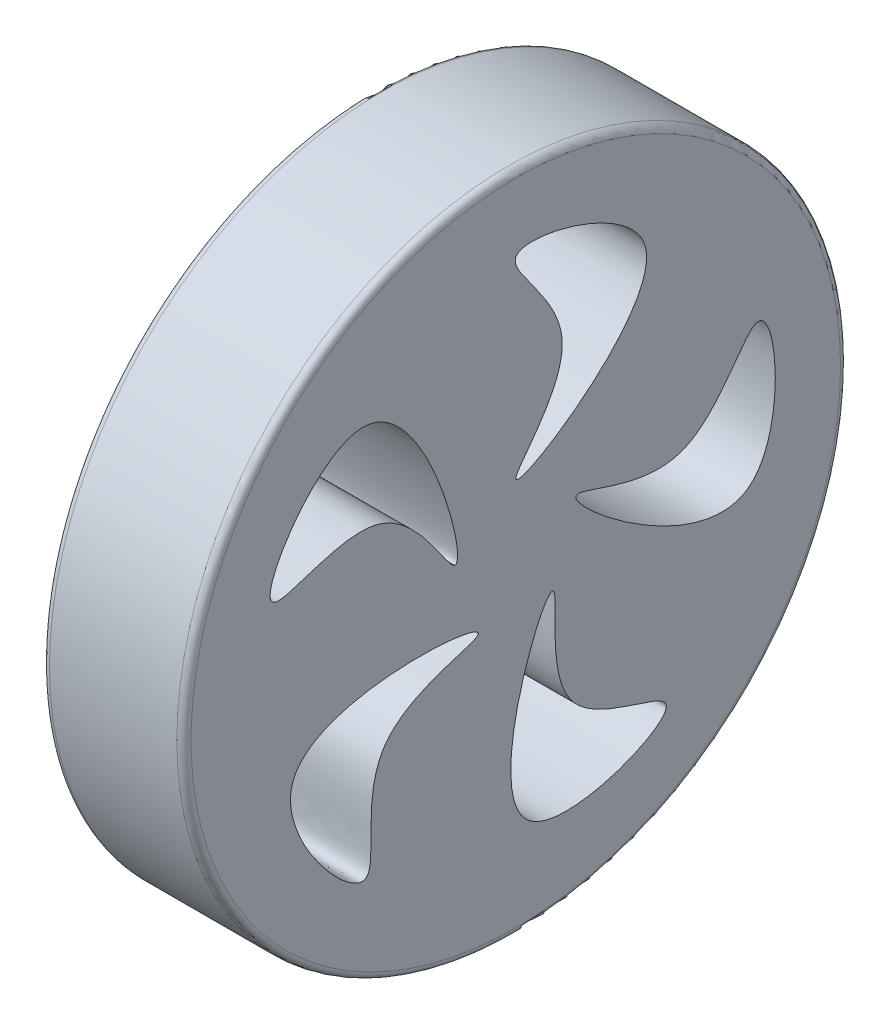
ISO-10303-21;
HEADER;
FILE_DESCRIPTION(('STEP AP214'),'2;1');
FILE_NAME('part.step','',(''),(''),'','','');
FILE_SCHEMA(('AUTOMOTIVE_DESIGN { 1 0 10303 214 1 1 1 1 }'));
ENDSEC;
DATA;
#1=APPLICATION_CONTEXT('core data for automotive mechanical design processes');
#2=APPLICATION_PROTOCOL_DEFINITION('international standard','automotive_design',2000,#1);
#3=PRODUCT_CONTEXT('',#1,'mechanical');
#4=PRODUCT('Part','Part','',(#3));
#5=PRODUCT_RELATED_PRODUCT_CATEGORY('part','',(#4));
#6=PRODUCT_DEFINITION_FORMATION('','',#4);
#7=PRODUCT_DEFINITION_CONTEXT('part definition',#1,'design');
#8=PRODUCT_DEFINITION('design','',#6,#7);
#9=PRODUCT_DEFINITION_SHAPE('','',#8);
#10=(LENGTH_UNIT() NAMED_UNIT(*) SI_UNIT(.MILLI.,.METRE.));
#11=(NAMED_UNIT(*) PLANE_ANGLE_UNIT() SI_UNIT($,.RADIAN.));
#12=(NAMED_UNIT(*) SI_UNIT($,.STERADIAN.) SOLID_ANGLE_UNIT());
#13=UNCERTAINTY_MEASURE_WITH_UNIT(LENGTH_MEASURE(1.E-05),#10,'distance_accuracy_value','');
#14=(GEOMETRIC_REPRESENTATION_CONTEXT(3) GLOBAL_UNCERTAINTY_ASSIGNED_CONTEXT((#13)) GLOBAL_UNIT_ASSIGNED_CONTEXT((#10,
#11,#12)) REPRESENTATION_CONTEXT('',''));
#15=CARTESIAN_POINT('',(0.,0.,0.));
#16=DIRECTION('',(0.,0.,1.));
#17=DIRECTION('',(1.,0.,0.));
#18=AXIS2_PLACEMENT_3D('',#15,#16,#17);
#19=CARTESIAN_POINT('',(20.,0.,0.));
#20=DIRECTION('',(-1.,0.,0.));
#21=DIRECTION('',(0.,0.,1.));
#22=AXIS2_PLACEMENT_3D('',#19,#20,#21);
#23=CYLINDRICAL_SURFACE('',#22,46.88);
#24=CARTESIAN_POINT('',(1.,0.,0.));
#25=DIRECTION('',(1.,0.,0.));
#26=DIRECTION('',(0.,0.,-1.));
#27=AXIS2_PLACEMENT_3D('',#24,#25,#26);
#28=CIRCLE('',#27,46.88);
#29=CARTESIAN_POINT('',(1.,0.,-46.88));
#30=VERTEX_POINT('',#29);
#31=EDGE_CURVE('E45',#30,#30,#28,.T.);
#32=ORIENTED_EDGE('',*,*,#31,.T.);
#33=EDGE_LOOP('',(#32));
#34=FACE_BOUND('',#33,.T.);
#35=CARTESIAN_POINT('',(19.,0.,0.));
#36=DIRECTION('',(1.,0.,0.));
#37=DIRECTION('',(0.,0.,-1.));
#38=AXIS2_PLACEMENT_3D('',#35,#36,#37);
#39=CIRCLE('',#38,46.88);
#40=CARTESIAN_POINT('',(19.,0.,-46.88));
#41=VERTEX_POINT('',#40);
#42=EDGE_CURVE('E49',#41,#41,#39,.F.);
#43=ORIENTED_EDGE('',*,*,#42,.T.);
#44=EDGE_LOOP('',(#43));
#45=FACE_BOUND('',#44,.T.);
#46=ADVANCED_FACE('F34',(#34,#45),#23,.T.);
#47=CARTESIAN_POINT('',(20.,0.,0.));
#48=DIRECTION('',(1.,0.,0.));
#49=DIRECTION('',(0.,0.,-1.));
#50=AXIS2_PLACEMENT_3D('',#47,#48,#49);
#51=PLANE('',#50);
#52=CARTESIAN_POINT('',(20.,0.,0.));
#53=DIRECTION('',(1.,0.,0.));
#54=DIRECTION('',(0.,0.,-1.));
#55=AXIS2_PLACEMENT_3D('',#52,#53,#54);
#56=CIRCLE('',#55,45.88);
#57=CARTESIAN_POINT('',(20.,0.,-45.88));
#58=VERTEX_POINT('',#57);
#59=EDGE_CURVE('E10',#58,#58,#56,.T.);
#60=ORIENTED_EDGE('',*,*,#59,.T.);
#61=EDGE_LOOP('',(#60));
#62=FACE_BOUND('',#61,.T.);
#63=CARTESIAN_POINT('',(20.,2.81803090171412,8.67300731345636));
#64=CARTESIAN_POINT('',(20.,1.9904427025529,6.4759868003006));
#65=CARTESIAN_POINT('',(20.,43.958070461011,17.0065174393699));
#66=CARTESIAN_POINT('',(20.,2.99113893993357,42.797354133509));
#67=CARTESIAN_POINT('',(20.,19.9397960038693,17.5810966951113));
#68=CARTESIAN_POINT('',(20.,3.28104704623283,9.90218864840154));
#69=CARTESIAN_POINT('',(20.,2.81803090171412,8.67300731345636));
#70=B_SPLINE_CURVE_WITH_KNOTS('',3,(#63,#64,#65,#66,#67,#68,#69),.UNSPECIFIED.,.T.,.F.,(4,1,1,1,
4),(0.,0.348478422836538,0.606981044630408,0.805034513598355,1.),.UNSPECIFIED.);
#71=CARTESIAN_POINT('',(20.,2.81803090171412,8.67300731345636));
#72=VERTEX_POINT('',#71);
#73=EDGE_CURVE('E129',#72,#72,#70,.T.);
#74=ORIENTED_EDGE('',*,*,#73,.F.);
#75=EDGE_LOOP('',(#74));
#76=FACE_BOUND('',#75,.T.);
#77=CARTESIAN_POINT('',(20.,-7.37770068203479,5.36021330439252));
#78=CARTESIAN_POINT('',(20.,-5.54394882444884,3.89421347921577));
#79=CARTESIAN_POINT('',(20.,-2.5903684178162,47.0619122596052));
#80=CARTESIAN_POINT('',(20.,-39.7783897638889,16.0698519215051));
#81=CARTESIAN_POINT('',(20.,-10.5588807459356,24.3967305816145));
#82=CARTESIAN_POINT('',(20.,-8.40364174301653,6.18040574745343));
#83=CARTESIAN_POINT('',(20.,-7.37770068203479,5.36021330439252));
#84=B_SPLINE_CURVE_WITH_KNOTS('',3,(#77,#78,#79,#80,#81,#82,#83),.UNSPECIFIED.,.T.,.F.,(4,1,1,1,
4),(0.,0.348478422836538,0.606981044630408,0.805034513598355,1.),.UNSPECIFIED.);
#85=CARTESIAN_POINT('',(20.,-7.37770068203479,5.36021330439252));
#86=VERTEX_POINT('',#85);
#87=EDGE_CURVE('E143',#86,#86,#84,.T.);
#88=ORIENTED_EDGE('',*,*,#87,.F.);
#89=EDGE_LOOP('',(#88));
#90=FACE_BOUND('',#89,.T.);
#91=CARTESIAN_POINT('',(20.,-7.37770068203486,-5.36021330439242));
#92=CARTESIAN_POINT('',(20.,-5.41679150795228,-4.06923051069728));
#93=CARTESIAN_POINT('',(20.,-45.5590061866057,12.0793439126313));
#94=CARTESIAN_POINT('',(20.,-27.5755358317576,-32.8656394518411));
#95=CARTESIAN_POINT('',(20.,-26.4655431880142,-2.50308798129966));
#96=CARTESIAN_POINT('',(20.,-8.4747832726944,-6.08248783221015));
#97=CARTESIAN_POINT('',(20.,-7.37770068203486,-5.36021330439242));
#98=B_SPLINE_CURVE_WITH_KNOTS('',3,(#91,#92,#93,#94,#95,#96,#97),.UNSPECIFIED.,.T.,.F.,(4,1,1,1,
4),(0.,0.348478422836538,0.606981044630408,0.805034513598355,1.),.UNSPECIFIED.);
#99=CARTESIAN_POINT('',(20.,-7.37770068203486,-5.36021330439242));
#100=VERTEX_POINT('',#99);
#101=EDGE_CURVE('E166',#100,#100,#98,.T.);
#102=ORIENTED_EDGE('',*,*,#101,.F.);
#103=EDGE_LOOP('',(#102));
#104=FACE_BOUND('',#103,.T.);
#105=CARTESIAN_POINT('',(20.,2.818030901714,-8.6730073134564));
#106=CARTESIAN_POINT('',(20.,2.19618756256258,-6.40913624288477));
#107=CARTESIAN_POINT('',(20.,-25.5666458991726,-39.5964671598));
#108=CARTESIAN_POINT('',(20.,22.7357713618723,-36.3819341647422));
#109=CARTESIAN_POINT('',(20.,-5.79772447498533,-25.9437240308891));
#110=CARTESIAN_POINT('',(20.,3.16593763320237,-9.93958996391694));
#111=CARTESIAN_POINT('',(20.,2.818030901714,-8.6730073134564));
#112=B_SPLINE_CURVE_WITH_KNOTS('',3,(#105,#106,#107,#108,#109,#110,#111),.UNSPECIFIED.,.T.,.F.,
(4,1,1,1,4),(0.,0.348478422836538,0.606981044630408,0.805034513598355,1.),.UNSPECIFIED.);
#113=CARTESIAN_POINT('',(20.,2.818030901714,-8.6730073134564));
#114=VERTEX_POINT('',#113);
#115=EDGE_CURVE('E193',#114,#114,#112,.T.);
#116=ORIENTED_EDGE('',*,*,#115,.F.);
#117=EDGE_LOOP('',(#116));
#118=FACE_BOUND('',#117,.T.);
#119=CARTESIAN_POINT('',(20.,9.11933934697701,1.45791625618525E-07));
#120=CARTESIAN_POINT('',(20.,6.77410984689813,0.108166639441142));
#121=CARTESIAN_POINT('',(20.,29.7579501299263,-36.55130688248));
#122=CARTESIAN_POINT('',(20.,41.6270153453987,10.3803678262817));
#123=CARTESIAN_POINT('',(20.,22.8823523792061,-13.5310154591588));
#124=CARTESIAN_POINT('',(20.,10.4314401344158,-0.0605164652638171));
#125=CARTESIAN_POINT('',(20.,9.11933934697701,1.45791625618525E-07));
#126=B_SPLINE_CURVE_WITH_KNOTS('',3,(#119,#120,#121,#122,#123,#124,#125),.UNSPECIFIED.,.T.,.F.,
(4,1,1,1,4),(0.,0.348478423266489,0.606981044681602,0.805034512162665,1.),.UNSPECIFIED.);
#127=CARTESIAN_POINT('',(20.,9.11933934697701,1.45791625618525E-07));
#128=VERTEX_POINT('',#127);
#129=EDGE_CURVE('E59',#128,#128,#126,.T.);
#130=ORIENTED_EDGE('',*,*,#129,.F.);
#131=EDGE_LOOP('',(#130));
#132=FACE_BOUND('',#131,.T.);
#133=ADVANCED_FACE('F91',(#62,#76,#90,#104,#118,#132),#51,.T.);
#134=CARTESIAN_POINT('',(0.,0.,0.));
#135=DIRECTION('',(1.,0.,0.));
#136=DIRECTION('',(0.,0.,-1.));
#137=AXIS2_PLACEMENT_3D('',#134,#135,#136);
#138=PLANE('',#137);
#139=CARTESIAN_POINT('',(0.,0.,0.));
#140=DIRECTION('',(1.,0.,0.));
#141=DIRECTION('',(0.,0.,-1.));
#142=AXIS2_PLACEMENT_3D('',#139,#140,#141);
#143=CIRCLE('',#142,45.88);
#144=CARTESIAN_POINT('',(0.,0.,-45.88));
#145=VERTEX_POINT('',#144);
#146=EDGE_CURVE('E41',#145,#145,#143,.F.);
#147=ORIENTED_EDGE('',*,*,#146,.T.);
#148=EDGE_LOOP('',(#147));
#149=FACE_BOUND('',#148,.T.);
#150=CARTESIAN_POINT('',(0.,2.81803090171412,8.67300731345636));
#151=CARTESIAN_POINT('',(0.,1.9904427025529,6.4759868003006));
#152=CARTESIAN_POINT('',(0.,43.958070461011,17.0065174393699));
#153=CARTESIAN_POINT('',(0.,2.99113893993357,42.797354133509));
#154=CARTESIAN_POINT('',(0.,19.9397960038693,17.5810966951113));
#155=CARTESIAN_POINT('',(0.,3.28104704623283,9.90218864840154));
#156=CARTESIAN_POINT('',(0.,2.81803090171412,8.67300731345636));
#157=B_SPLINE_CURVE_WITH_KNOTS('',3,(#150,#151,#152,#153,#154,#155,#156),.UNSPECIFIED.,.T.,.F.,
(4,1,1,1,4),(0.,0.348478422836538,0.606981044630408,0.805034513598355,1.),.UNSPECIFIED.);
#158=CARTESIAN_POINT('',(0.,2.81803090171412,8.67300731345636));
#159=VERTEX_POINT('',#158);
#160=EDGE_CURVE('E136',#159,#159,#157,.F.);
#161=ORIENTED_EDGE('',*,*,#160,.F.);
#162=EDGE_LOOP('',(#161));
#163=FACE_BOUND('',#162,.T.);
#164=CARTESIAN_POINT('',(0.,-7.37770068203479,5.36021330439252));
#165=CARTESIAN_POINT('',(0.,-5.54394882444884,3.89421347921577));
#166=CARTESIAN_POINT('',(0.,-2.5903684178162,47.0619122596052));
#167=CARTESIAN_POINT('',(0.,-39.7783897638889,16.0698519215051));
#168=CARTESIAN_POINT('',(0.,-10.5588807459356,24.3967305816145));
#169=CARTESIAN_POINT('',(0.,-8.40364174301653,6.18040574745343));
#170=CARTESIAN_POINT('',(0.,-7.37770068203479,5.36021330439252));
#171=B_SPLINE_CURVE_WITH_KNOTS('',3,(#164,#165,#166,#167,#168,#169,#170),.UNSPECIFIED.,.T.,.F.,
(4,1,1,1,4),(0.,0.348478422836538,0.606981044630408,0.805034513598355,1.),.UNSPECIFIED.);
#172=CARTESIAN_POINT('',(0.,-7.37770068203479,5.36021330439252));
#173=VERTEX_POINT('',#172);
#174=EDGE_CURVE('E158',#173,#173,#171,.F.);
#175=ORIENTED_EDGE('',*,*,#174,.F.);
#176=EDGE_LOOP('',(#175));
#177=FACE_BOUND('',#176,.T.);
#178=CARTESIAN_POINT('',(0.,-7.37770068203486,-5.36021330439242));
#179=CARTESIAN_POINT('',(0.,-5.41679150795228,-4.06923051069728));
#180=CARTESIAN_POINT('',(0.,-45.5590061866057,12.0793439126313));
#181=CARTESIAN_POINT('',(0.,-27.5755358317576,-32.8656394518411));
#182=CARTESIAN_POINT('',(0.,-26.4655431880142,-2.50308798129966));
#183=CARTESIAN_POINT('',(0.,-8.4747832726944,-6.08248783221015));
#184=CARTESIAN_POINT('',(0.,-7.37770068203486,-5.36021330439242));
#185=B_SPLINE_CURVE_WITH_KNOTS('',3,(#178,#179,#180,#181,#182,#183,#184),.UNSPECIFIED.,.T.,.F.,
(4,1,1,1,4),(0.,0.348478422836538,0.606981044630408,0.805034513598355,1.),.UNSPECIFIED.);
#186=CARTESIAN_POINT('',(0.,-7.37770068203486,-5.36021330439242));
#187=VERTEX_POINT('',#186);
#188=EDGE_CURVE('E191',#187,#187,#185,.F.);
#189=ORIENTED_EDGE('',*,*,#188,.F.);
#190=EDGE_LOOP('',(#189));
#191=FACE_BOUND('',#190,.T.);
#192=CARTESIAN_POINT('',(0.,2.818030901714,-8.6730073134564));
#193=CARTESIAN_POINT('',(0.,2.19618756256258,-6.40913624288477));
#194=CARTESIAN_POINT('',(0.,-25.5666458991726,-39.5964671598));
#195=CARTESIAN_POINT('',(0.,22.7357713618723,-36.3819341647422));
#196=CARTESIAN_POINT('',(0.,-5.79772447498533,-25.9437240308891));
#197=CARTESIAN_POINT('',(0.,3.16593763320237,-9.93958996391694));
#198=CARTESIAN_POINT('',(0.,2.818030901714,-8.6730073134564));
#199=B_SPLINE_CURVE_WITH_KNOTS('',3,(#192,#193,#194,#195,#196,#197,#198),.UNSPECIFIED.,.T.,.F.,
(4,1,1,1,4),(0.,0.348478422836538,0.606981044630408,0.805034513598355,1.),.UNSPECIFIED.);
#200=CARTESIAN_POINT('',(0.,2.818030901714,-8.6730073134564));
#201=VERTEX_POINT('',#200);
#202=EDGE_CURVE('E67',#201,#201,#199,.F.);
#203=ORIENTED_EDGE('',*,*,#202,.F.);
#204=EDGE_LOOP('',(#203));
#205=FACE_BOUND('',#204,.T.);
#206=CARTESIAN_POINT('',(0.,9.11933934697701,1.45791625618525E-07));
#207=CARTESIAN_POINT('',(0.,6.77410984689813,0.108166639441142));
#208=CARTESIAN_POINT('',(0.,29.7579501299263,-36.55130688248));
#209=CARTESIAN_POINT('',(0.,41.6270153453987,10.3803678262817));
#210=CARTESIAN_POINT('',(0.,22.8823523792061,-13.5310154591588));
#211=CARTESIAN_POINT('',(0.,10.4314401344158,-0.0605164652638171));
#212=CARTESIAN_POINT('',(0.,9.11933934697701,1.45791625618525E-07));
#213=B_SPLINE_CURVE_WITH_KNOTS('',3,(#206,#207,#208,#209,#210,#211,#212),.UNSPECIFIED.,.T.,.F.,
(4,1,1,1,4),(0.,0.348478423266489,0.606981044681602,0.805034512162665,1.),.UNSPECIFIED.);
#214=CARTESIAN_POINT('',(0.,9.11933934697701,1.45791625618525E-07));
#215=VERTEX_POINT('',#214);
#216=EDGE_CURVE('E54',#215,#215,#213,.F.);
#217=ORIENTED_EDGE('',*,*,#216,.F.);
#218=EDGE_LOOP('',(#217));
#219=FACE_BOUND('',#218,.T.);
#220=ADVANCED_FACE('F87',(#149,#163,#177,#191,#205,#219),#138,.F.);
#221=CARTESIAN_POINT('',(-0.001000000000001,9.11933934697701,1.45791625618525E-07));
#222=CARTESIAN_POINT('',(-0.001000000000001,6.77410984689813,0.108166639441142));
#223=CARTESIAN_POINT('',(-0.001000000000001,29.7579501299263,-36.55130688248));
#224=CARTESIAN_POINT('',(-0.001000000000001,41.6270153453987,10.3803678262817));
#225=CARTESIAN_POINT('',(-0.001000000000001,22.8823523792061,-13.5310154591588));
#226=CARTESIAN_POINT('',(-0.001000000000001,10.4314401344158,-0.0605164652638171));
#227=CARTESIAN_POINT('',(-0.001000000000001,9.11933934697701,1.45791625618525E-07));
#228=B_SPLINE_CURVE_WITH_KNOTS('',3,(#221,#222,#223,#224,#225,#226,#227),.UNSPECIFIED.,.T.,.F.,
(4,1,1,1,4),(0.,0.348478423266489,0.606981044681602,0.805034512162665,1.),.UNSPECIFIED.);
#229=DIRECTION('',(1.,0.,0.));
#230=VECTOR('',#229,1.);
#231=SURFACE_OF_LINEAR_EXTRUSION('',#228,#230);
#232=ORIENTED_EDGE('',*,*,#129,.T.);
#233=EDGE_LOOP('',(#232));
#234=FACE_BOUND('',#233,.T.);
#235=ORIENTED_EDGE('',*,*,#216,.T.);
#236=EDGE_LOOP('',(#235));
#237=FACE_BOUND('',#236,.T.);
#238=ADVANCED_FACE('F82',(#234,#237),#231,.F.);
#239=CARTESIAN_POINT('',(-0.001000000000001,2.818030901714,-8.6730073134564));
#240=CARTESIAN_POINT('',(-0.001000000000001,2.19618756256258,-6.40913624288477));
#241=CARTESIAN_POINT('',(-0.001000000000001,-25.5666458991726,-39.5964671598));
#242=CARTESIAN_POINT('',(-0.001000000000001,22.7357713618723,-36.3819341647422));
#243=CARTESIAN_POINT('',(-0.001000000000001,-5.79772447498533,-25.9437240308891));
#244=CARTESIAN_POINT('',(-0.001000000000001,3.16593763320237,-9.93958996391694));
#245=CARTESIAN_POINT('',(-0.001000000000001,2.818030901714,-8.6730073134564));
#246=B_SPLINE_CURVE_WITH_KNOTS('',3,(#239,#240,#241,#242,#243,#244,#245),.UNSPECIFIED.,.T.,.F.,
(4,1,1,1,4),(0.,0.348478422836538,0.606981044630408,0.805034513598355,1.),.UNSPECIFIED.);
#247=DIRECTION('',(1.,0.,0.));
#248=VECTOR('',#247,1.);
#249=SURFACE_OF_LINEAR_EXTRUSION('',#246,#248);
#250=ORIENTED_EDGE('',*,*,#115,.T.);
#251=EDGE_LOOP('',(#250));
#252=FACE_BOUND('',#251,.T.);
#253=ORIENTED_EDGE('',*,*,#202,.T.);
#254=EDGE_LOOP('',(#253));
#255=FACE_BOUND('',#254,.T.);
#256=ADVANCED_FACE('F86',(#252,#255),#249,.F.);
#257=CARTESIAN_POINT('',(-0.001000000000001,-7.37770068203486,-5.36021330439242));
#258=CARTESIAN_POINT('',(-0.001000000000001,-5.41679150795228,-4.06923051069728));
#259=CARTESIAN_POINT('',(-0.001000000000001,-45.5590061866057,12.0793439126313));
#260=CARTESIAN_POINT('',(-0.001000000000001,-27.5755358317576,-32.8656394518411));
#261=CARTESIAN_POINT('',(-0.001000000000001,-26.4655431880142,-2.50308798129966));
#262=CARTESIAN_POINT('',(-0.001000000000001,-8.4747832726944,-6.08248783221015));
#263=CARTESIAN_POINT('',(-0.001000000000001,-7.37770068203486,-5.36021330439242));
#264=B_SPLINE_CURVE_WITH_KNOTS('',3,(#257,#258,#259,#260,#261,#262,#263),.UNSPECIFIED.,.T.,.F.,
(4,1,1,1,4),(0.,0.348478422836538,0.606981044630408,0.805034513598355,1.),.UNSPECIFIED.);
#265=DIRECTION('',(1.,0.,0.));
#266=VECTOR('',#265,1.);
#267=SURFACE_OF_LINEAR_EXTRUSION('',#264,#266);
#268=ORIENTED_EDGE('',*,*,#101,.T.);
#269=EDGE_LOOP('',(#268));
#270=FACE_BOUND('',#269,.T.);
#271=ORIENTED_EDGE('',*,*,#188,.T.);
#272=EDGE_LOOP('',(#271));
#273=FACE_BOUND('',#272,.T.);
#274=ADVANCED_FACE('F118',(#270,#273),#267,.F.);
#275=CARTESIAN_POINT('',(-0.001000000000001,-7.37770068203479,5.36021330439252));
#276=CARTESIAN_POINT('',(-0.001000000000001,-5.54394882444884,3.89421347921577));
#277=CARTESIAN_POINT('',(-0.001000000000001,-2.5903684178162,47.0619122596052));
#278=CARTESIAN_POINT('',(-0.001000000000001,-39.7783897638889,16.0698519215051));
#279=CARTESIAN_POINT('',(-0.001000000000001,-10.5588807459356,24.3967305816145));
#280=CARTESIAN_POINT('',(-0.001000000000001,-8.40364174301653,6.18040574745343));
#281=CARTESIAN_POINT('',(-0.001000000000001,-7.37770068203479,5.36021330439252));
#282=B_SPLINE_CURVE_WITH_KNOTS('',3,(#275,#276,#277,#278,#279,#280,#281),.UNSPECIFIED.,.T.,.F.,
(4,1,1,1,4),(0.,0.348478422836538,0.606981044630408,0.805034513598355,1.),.UNSPECIFIED.);
#283=DIRECTION('',(1.,0.,0.));
#284=VECTOR('',#283,1.);
#285=SURFACE_OF_LINEAR_EXTRUSION('',#282,#284);
#286=ORIENTED_EDGE('',*,*,#87,.T.);
#287=EDGE_LOOP('',(#286));
#288=FACE_BOUND('',#287,.T.);
#289=ORIENTED_EDGE('',*,*,#174,.T.);
#290=EDGE_LOOP('',(#289));
#291=FACE_BOUND('',#290,.T.);
#292=ADVANCED_FACE('F107',(#288,#291),#285,.F.);
#293=CARTESIAN_POINT('',(-0.001000000000001,2.81803090171412,8.67300731345636));
#294=CARTESIAN_POINT('',(-0.001000000000001,1.9904427025529,6.4759868003006));
#295=CARTESIAN_POINT('',(-0.001000000000001,43.958070461011,17.0065174393699));
#296=CARTESIAN_POINT('',(-0.001000000000001,2.99113893993357,42.797354133509));
#297=CARTESIAN_POINT('',(-0.001000000000001,19.9397960038693,17.5810966951113));
#298=CARTESIAN_POINT('',(-0.001000000000001,3.28104704623283,9.90218864840154));
#299=CARTESIAN_POINT('',(-0.001000000000001,2.81803090171412,8.67300731345636));
#300=B_SPLINE_CURVE_WITH_KNOTS('',3,(#293,#294,#295,#296,#297,#298,#299),.UNSPECIFIED.,.T.,.F.,
(4,1,1,1,4),(0.,0.348478422836538,0.606981044630408,0.805034513598355,1.),.UNSPECIFIED.);
#301=DIRECTION('',(1.,0.,0.));
#302=VECTOR('',#301,1.);
#303=SURFACE_OF_LINEAR_EXTRUSION('',#300,#302);
#304=ORIENTED_EDGE('',*,*,#73,.T.);
#305=EDGE_LOOP('',(#304));
#306=FACE_BOUND('',#305,.T.);
#307=ORIENTED_EDGE('',*,*,#160,.T.);
#308=EDGE_LOOP('',(#307));
#309=FACE_BOUND('',#308,.T.);
#310=ADVANCED_FACE('F100',(#306,#309),#303,.F.);
#311=CARTESIAN_POINT('',(1.,0.,0.));
#312=DIRECTION('',(1.,0.,0.));
#313=DIRECTION('',(0.,0.,-1.));
#314=AXIS2_PLACEMENT_3D('',#311,#312,#313);
#315=TOROIDAL_SURFACE('',#314,45.88,1.);
#316=ORIENTED_EDGE('',*,*,#146,.F.);
#317=EDGE_LOOP('',(#316));
#318=FACE_BOUND('',#317,.T.);
#319=ORIENTED_EDGE('',*,*,#31,.F.);
#320=EDGE_LOOP('',(#319));
#321=FACE_BOUND('',#320,.T.);
#322=ADVANCED_FACE('F98',(#318,#321),#315,.T.);
#323=CARTESIAN_POINT('',(19.,0.,0.));
#324=DIRECTION('',(1.,0.,0.));
#325=DIRECTION('',(0.,0.,-1.));
#326=AXIS2_PLACEMENT_3D('',#323,#324,#325);
#327=TOROIDAL_SURFACE('',#326,45.88,1.);
#328=ORIENTED_EDGE('',*,*,#42,.F.);
#329=EDGE_LOOP('',(#328));
#330=FACE_BOUND('',#329,.T.);
#331=ORIENTED_EDGE('',*,*,#59,.F.);
#332=EDGE_LOOP('',(#331));
#333=FACE_BOUND('',#332,.T.);
#334=ADVANCED_FACE('F36',(#330,#333),#327,.T.);
#335=CLOSED_SHELL('',(#46,#133,#220,#238,#256,#274,#292,#310,#322,#334));
#336=MANIFOLD_SOLID_BREP('B2',#335);
#337=ADVANCED_BREP_SHAPE_REPRESENTATION('',(#18,#336),#14);
#338=SHAPE_DEFINITION_REPRESENTATION(#9,#337);
ENDSEC;
END-ISO-10303-21;
